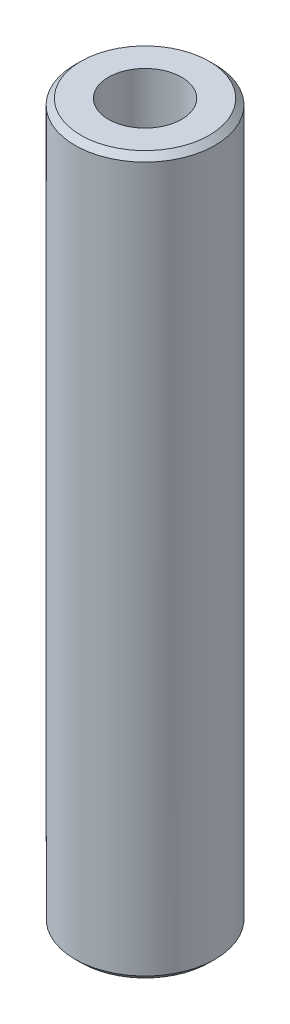
ISO-10303-21;
HEADER;
FILE_DESCRIPTION(('STEP AP214'),'2;1');
FILE_NAME('part.step','',(''),(''),'','','');
FILE_SCHEMA(('AUTOMOTIVE_DESIGN { 1 0 10303 214 1 1 1 1 }'));
ENDSEC;
DATA;
#1=APPLICATION_CONTEXT('core data for automotive mechanical design processes');
#2=APPLICATION_PROTOCOL_DEFINITION('international standard','automotive_design',2000,#1);
#3=PRODUCT_CONTEXT('',#1,'mechanical');
#4=PRODUCT('Part','Part','',(#3));
#5=PRODUCT_RELATED_PRODUCT_CATEGORY('part','',(#4));
#6=PRODUCT_DEFINITION_FORMATION('','',#4);
#7=PRODUCT_DEFINITION_CONTEXT('part definition',#1,'design');
#8=PRODUCT_DEFINITION('design','',#6,#7);
#9=PRODUCT_DEFINITION_SHAPE('','',#8);
#10=(LENGTH_UNIT() NAMED_UNIT(*) SI_UNIT(.MILLI.,.METRE.));
#11=(NAMED_UNIT(*) PLANE_ANGLE_UNIT() SI_UNIT($,.RADIAN.));
#12=(NAMED_UNIT(*) SI_UNIT($,.STERADIAN.) SOLID_ANGLE_UNIT());
#13=UNCERTAINTY_MEASURE_WITH_UNIT(LENGTH_MEASURE(1.E-05),#10,'distance_accuracy_value','');
#14=(GEOMETRIC_REPRESENTATION_CONTEXT(3) GLOBAL_UNCERTAINTY_ASSIGNED_CONTEXT((#13)) GLOBAL_UNIT_ASSIGNED_CONTEXT((#10,
#11,#12)) REPRESENTATION_CONTEXT('',''));
#15=CARTESIAN_POINT('',(0.,0.,0.));
#16=DIRECTION('',(0.,0.,1.));
#17=DIRECTION('',(1.,0.,0.));
#18=AXIS2_PLACEMENT_3D('',#15,#16,#17);
#19=CARTESIAN_POINT('',(0.,24.384,0.));
#20=DIRECTION('',(0.,-1.,0.));
#21=DIRECTION('',(0.,0.,-1.));
#22=AXIS2_PLACEMENT_3D('',#19,#20,#21);
#23=CYLINDRICAL_SURFACE('',#22,4.7625);
#24=CARTESIAN_POINT('',(0.,-23.987125,0.));
#25=DIRECTION('',(0.,1.,0.));
#26=DIRECTION('',(0.,0.,1.));
#27=AXIS2_PLACEMENT_3D('',#24,#25,#26);
#28=CIRCLE('',#27,4.7625);
#29=CARTESIAN_POINT('',(0.,-23.987125,-4.7625));
#30=VERTEX_POINT('',#29);
#31=EDGE_CURVE('E45',#30,#30,#28,.T.);
#32=CARTESIAN_POINT('',(0.,23.987125,0.));
#33=DIRECTION('',(0.,1.,0.));
#34=DIRECTION('',(0.,0.,1.));
#35=AXIS2_PLACEMENT_3D('',#32,#33,#34);
#36=CIRCLE('',#35,4.7625);
#37=CARTESIAN_POINT('',(0.,23.987125,-4.7625));
#38=VERTEX_POINT('',#37);
#39=EDGE_CURVE('E49',#38,#38,#36,.F.);
#40=CARTESIAN_POINT('',(0.,-23.987125,-4.7625));
#41=CARTESIAN_POINT('',(0.,-23.4873932291666,-4.7625));
#42=CARTESIAN_POINT('',(0.,-22.9876614583333,-4.7625));
#43=CARTESIAN_POINT('',(0.,-21.9881979166666,-4.7625));
#44=CARTESIAN_POINT('',(0.,-21.4884661458333,-4.7625));
#45=CARTESIAN_POINT('',(0.,-20.4890026041666,-4.7625));
#46=CARTESIAN_POINT('',(0.,-19.9892708333333,-4.7625));
#47=CARTESIAN_POINT('',(0.,-18.9898072916666,-4.7625));
#48=CARTESIAN_POINT('',(0.,-18.4900755208333,-4.7625));
#49=CARTESIAN_POINT('',(0.,-17.4906119791666,-4.7625));
#50=CARTESIAN_POINT('',(0.,-16.9908802083333,-4.7625));
#51=CARTESIAN_POINT('',(0.,-15.9914166666666,-4.7625));
#52=CARTESIAN_POINT('',(0.,-15.4916848958333,-4.7625));
#53=CARTESIAN_POINT('',(0.,-14.4922213541666,-4.7625));
#54=CARTESIAN_POINT('',(0.,-13.9924895833333,-4.7625));
#55=CARTESIAN_POINT('',(0.,-12.9930260416666,-4.7625));
#56=CARTESIAN_POINT('',(0.,-12.4932942708333,-4.7625));
#57=CARTESIAN_POINT('',(0.,-11.4938307291666,-4.7625));
#58=CARTESIAN_POINT('',(0.,-10.9940989583333,-4.7625));
#59=CARTESIAN_POINT('',(0.,-9.99463541666664,-4.7625));
#60=CARTESIAN_POINT('',(0.,-9.4949036458333,-4.7625));
#61=CARTESIAN_POINT('',(0.,-8.49544010416663,-4.7625));
#62=CARTESIAN_POINT('',(0.,-7.9957083333333,-4.7625));
#63=CARTESIAN_POINT('',(0.,-6.99624479166664,-4.7625));
#64=CARTESIAN_POINT('',(0.,-6.4965130208333,-4.7625));
#65=CARTESIAN_POINT('',(0.,-5.49704947916664,-4.7625));
#66=CARTESIAN_POINT('',(0.,-4.9973177083333,-4.7625));
#67=CARTESIAN_POINT('',(0.,-3.99785416666664,-4.7625));
#68=CARTESIAN_POINT('',(0.,-3.49812239583331,-4.7625));
#69=CARTESIAN_POINT('',(0.,-2.49865885416664,-4.7625));
#70=CARTESIAN_POINT('',(0.,-1.99892708333331,-4.7625));
#71=CARTESIAN_POINT('',(0.,-0.999463541666639,-4.7625));
#72=CARTESIAN_POINT('',(0.,-0.499731770833305,-4.7625));
#73=CARTESIAN_POINT('',(0.,0.499731770833361,-4.7625));
#74=CARTESIAN_POINT('',(0.,0.999463541666694,-4.7625));
#75=CARTESIAN_POINT('',(0.,1.99892708333336,-4.7625));
#76=CARTESIAN_POINT('',(0.,2.49865885416669,-4.7625));
#77=CARTESIAN_POINT('',(0.,3.49812239583336,-4.7625));
#78=CARTESIAN_POINT('',(0.,3.99785416666669,-4.7625));
#79=CARTESIAN_POINT('',(0.,4.99731770833336,-4.7625));
#80=CARTESIAN_POINT('',(0.,5.49704947916669,-4.7625));
#81=CARTESIAN_POINT('',(0.,6.49651302083336,-4.7625));
#82=CARTESIAN_POINT('',(0.,6.99624479166669,-4.7625));
#83=CARTESIAN_POINT('',(0.,7.99570833333336,-4.7625));
#84=CARTESIAN_POINT('',(0.,8.49544010416669,-4.7625));
#85=CARTESIAN_POINT('',(0.,9.49490364583336,-4.7625));
#86=CARTESIAN_POINT('',(0.,9.99463541666669,-4.7625));
#87=CARTESIAN_POINT('',(0.,10.9940989583334,-4.7625));
#88=CARTESIAN_POINT('',(0.,11.4938307291667,-4.7625));
#89=CARTESIAN_POINT('',(0.,12.4932942708334,-4.7625));
#90=CARTESIAN_POINT('',(0.,12.9930260416667,-4.7625));
#91=CARTESIAN_POINT('',(0.,13.9924895833334,-4.7625));
#92=CARTESIAN_POINT('',(0.,14.4922213541667,-4.7625));
#93=CARTESIAN_POINT('',(0.,15.4916848958334,-4.7625));
#94=CARTESIAN_POINT('',(0.,15.9914166666667,-4.7625));
#95=CARTESIAN_POINT('',(0.,16.9908802083334,-4.7625));
#96=CARTESIAN_POINT('',(0.,17.4906119791667,-4.7625));
#97=CARTESIAN_POINT('',(0.,18.4900755208334,-4.7625));
#98=CARTESIAN_POINT('',(0.,18.9898072916667,-4.7625));
#99=CARTESIAN_POINT('',(0.,19.9892708333334,-4.7625));
#100=CARTESIAN_POINT('',(0.,20.4890026041667,-4.7625));
#101=CARTESIAN_POINT('',(0.,21.4884661458334,-4.7625));
#102=CARTESIAN_POINT('',(0.,21.9881979166667,-4.7625));
#103=CARTESIAN_POINT('',(0.,22.9876614583334,-4.7625));
#104=CARTESIAN_POINT('',(0.,23.4873932291667,-4.7625));
#105=CARTESIAN_POINT('',(0.,23.987125,-4.7625));
#106=B_SPLINE_CURVE_WITH_KNOTS('',3,(#40,#41,#42,#43,#44,#45,#46,#47,#48,#49,#50,#51,#52,#53,
#54,#55,#56,#57,#58,#59,#60,#61,#62,#63,#64,#65,#66,#67,#68,#69,#70,#71,#72,#73,#74,#75,#76,#77,
#78,#79,#80,#81,#82,#83,#84,#85,#86,#87,#88,#89,#90,#91,#92,#93,#94,#95,#96,#97,#98,#99,#100,
#101,#102,#103,#104,#105),.UNSPECIFIED.,.F.,.F.,(4,2,2,2,2,2,2,2,2,2,2,2,2,2,2,2,2,2,2,2,2,2,2,
2,2,2,2,2,2,2,2,2,4),(0.,1.4991953125,2.998390625,4.4975859375,5.99678125,7.4959765625,
8.995171875,10.4943671875,11.9935625,13.4927578125,14.991953125,16.4911484375,17.99034375,
19.4895390625,20.988734375,22.4879296875,23.987125,25.4863203125,26.985515625,28.4847109375,
29.98390625,31.4831015625,32.982296875,34.4814921875,35.9806875,37.4798828125,38.979078125,
40.4782734375,41.97746875,43.4766640625,44.975859375,46.4750546875,47.97425),.UNSPECIFIED.);
#107=EDGE_CURVE('BSEAM33',#30,#38,#106,.T.);
#108=ORIENTED_EDGE('',*,*,#31,.T.);
#109=ORIENTED_EDGE('',*,*,#39,.T.);
#110=ORIENTED_EDGE('',*,*,#107,.T.);
#111=ORIENTED_EDGE('',*,*,#107,.F.);
#112=EDGE_LOOP('',(#108,#110,#109,#111));
#113=FACE_BOUND('',#112,.T.);
#114=ADVANCED_FACE('F33',(#113),#23,.T.);
#115=CARTESIAN_POINT('',(0.,24.384,0.));
#116=DIRECTION('',(0.,1.,0.));
#117=DIRECTION('',(0.,0.,1.));
#118=AXIS2_PLACEMENT_3D('',#115,#116,#117);
#119=PLANE('',#118);
#120=CARTESIAN_POINT('',(0.,24.384,0.));
#121=DIRECTION('',(0.,1.,0.));
#122=DIRECTION('',(0.,0.,1.));
#123=AXIS2_PLACEMENT_3D('',#120,#121,#122);
#124=CIRCLE('',#123,2.4892);
#125=CARTESIAN_POINT('',(0.,24.384,2.4892));
#126=VERTEX_POINT('',#125);
#127=EDGE_CURVE('E57',#126,#126,#124,.T.);
#128=ORIENTED_EDGE('',*,*,#127,.F.);
#129=EDGE_LOOP('',(#128));
#130=FACE_BOUND('',#129,.T.);
#131=CARTESIAN_POINT('',(0.,24.384,0.));
#132=DIRECTION('',(0.,1.,0.));
#133=DIRECTION('',(0.,0.,1.));
#134=AXIS2_PLACEMENT_3D('',#131,#132,#133);
#135=CIRCLE('',#134,4.36562500000003);
#136=CARTESIAN_POINT('',(0.,24.384,4.36562500000003));
#137=VERTEX_POINT('',#136);
#138=EDGE_CURVE('E10',#137,#137,#135,.T.);
#139=ORIENTED_EDGE('',*,*,#138,.T.);
#140=EDGE_LOOP('',(#139));
#141=FACE_BOUND('',#140,.T.);
#142=ADVANCED_FACE('F63',(#130,#141),#119,.T.);
#143=CARTESIAN_POINT('',(0.,-24.384,0.));
#144=DIRECTION('',(0.,1.,0.));
#145=DIRECTION('',(0.,0.,1.));
#146=AXIS2_PLACEMENT_3D('',#143,#144,#145);
#147=PLANE('',#146);
#148=CARTESIAN_POINT('',(0.,-24.384,0.));
#149=DIRECTION('',(0.,1.,0.));
#150=DIRECTION('',(0.,0.,1.));
#151=AXIS2_PLACEMENT_3D('',#148,#149,#150);
#152=CIRCLE('',#151,2.4892);
#153=CARTESIAN_POINT('',(0.,-24.384,2.4892));
#154=VERTEX_POINT('',#153);
#155=EDGE_CURVE('E54',#154,#154,#152,.T.);
#156=ORIENTED_EDGE('',*,*,#155,.T.);
#157=EDGE_LOOP('',(#156));
#158=FACE_BOUND('',#157,.T.);
#159=CARTESIAN_POINT('',(0.,-24.384,0.));
#160=DIRECTION('',(0.,1.,0.));
#161=DIRECTION('',(0.,0.,1.));
#162=AXIS2_PLACEMENT_3D('',#159,#160,#161);
#163=CIRCLE('',#162,4.36562499999996);
#164=CARTESIAN_POINT('',(0.,-24.384,4.36562499999996));
#165=VERTEX_POINT('',#164);
#166=EDGE_CURVE('E41',#165,#165,#163,.F.);
#167=ORIENTED_EDGE('',*,*,#166,.T.);
#168=EDGE_LOOP('',(#167));
#169=FACE_BOUND('',#168,.T.);
#170=ADVANCED_FACE('F65',(#158,#169),#147,.F.);
#171=CARTESIAN_POINT('',(0.,-23.987125,0.));
#172=DIRECTION('',(0.,1.,0.));
#173=DIRECTION('',(0.,0.,1.));
#174=AXIS2_PLACEMENT_3D('',#171,#172,#173);
#175=CONICAL_SURFACE('',#174,4.7625,0.785398163397446);
#176=ORIENTED_EDGE('',*,*,#166,.F.);
#177=EDGE_LOOP('',(#176));
#178=FACE_BOUND('',#177,.T.);
#179=ORIENTED_EDGE('',*,*,#31,.F.);
#180=EDGE_LOOP('',(#179));
#181=FACE_BOUND('',#180,.T.);
#182=ADVANCED_FACE('F71',(#178,#181),#175,.T.);
#183=CARTESIAN_POINT('',(0.,24.384,0.));
#184=DIRECTION('',(0.,-1.,0.));
#185=DIRECTION('',(0.,0.,-1.));
#186=AXIS2_PLACEMENT_3D('',#183,#184,#185);
#187=CONICAL_SURFACE('',#186,4.36562500000003,0.785398163397442);
#188=ORIENTED_EDGE('',*,*,#39,.F.);
#189=EDGE_LOOP('',(#188));
#190=FACE_BOUND('',#189,.T.);
#191=ORIENTED_EDGE('',*,*,#138,.F.);
#192=EDGE_LOOP('',(#191));
#193=FACE_BOUND('',#192,.T.);
#194=ADVANCED_FACE('F36',(#190,#193),#187,.T.);
#195=CARTESIAN_POINT('',(0.,-24.384,0.));
#196=DIRECTION('',(0.,1.,0.));
#197=DIRECTION('',(0.,0.,1.));
#198=AXIS2_PLACEMENT_3D('',#195,#196,#197);
#199=CYLINDRICAL_SURFACE('',#198,2.4892);
#200=CARTESIAN_POINT('',(0.,-24.384,2.4892));
#201=CARTESIAN_POINT('',(0.,-23.876,2.4892));
#202=CARTESIAN_POINT('',(0.,-23.368,2.4892));
#203=CARTESIAN_POINT('',(0.,-22.352,2.4892));
#204=CARTESIAN_POINT('',(0.,-21.844,2.4892));
#205=CARTESIAN_POINT('',(0.,-20.828,2.4892));
#206=CARTESIAN_POINT('',(0.,-20.32,2.4892));
#207=CARTESIAN_POINT('',(0.,-19.304,2.4892));
#208=CARTESIAN_POINT('',(0.,-18.796,2.4892));
#209=CARTESIAN_POINT('',(0.,-17.78,2.4892));
#210=CARTESIAN_POINT('',(0.,-17.272,2.4892));
#211=CARTESIAN_POINT('',(0.,-16.256,2.4892));
#212=CARTESIAN_POINT('',(0.,-15.748,2.4892));
#213=CARTESIAN_POINT('',(0.,-14.732,2.4892));
#214=CARTESIAN_POINT('',(0.,-14.224,2.4892));
#215=CARTESIAN_POINT('',(0.,-13.208,2.4892));
#216=CARTESIAN_POINT('',(0.,-12.7,2.4892));
#217=CARTESIAN_POINT('',(0.,-11.684,2.4892));
#218=CARTESIAN_POINT('',(0.,-11.176,2.4892));
#219=CARTESIAN_POINT('',(0.,-10.16,2.4892));
#220=CARTESIAN_POINT('',(0.,-9.652,2.4892));
#221=CARTESIAN_POINT('',(0.,-8.636,2.4892));
#222=CARTESIAN_POINT('',(0.,-8.128,2.4892));
#223=CARTESIAN_POINT('',(0.,-7.112,2.4892));
#224=CARTESIAN_POINT('',(0.,-6.604,2.4892));
#225=CARTESIAN_POINT('',(0.,-5.588,2.4892));
#226=CARTESIAN_POINT('',(0.,-5.08,2.4892));
#227=CARTESIAN_POINT('',(0.,-4.064,2.4892));
#228=CARTESIAN_POINT('',(0.,-3.556,2.4892));
#229=CARTESIAN_POINT('',(0.,-2.54000000000001,2.4892));
#230=CARTESIAN_POINT('',(0.,-2.032,2.4892));
#231=CARTESIAN_POINT('',(0.,-1.016,2.4892));
#232=CARTESIAN_POINT('',(0.,-0.508000000000004,2.4892));
#233=CARTESIAN_POINT('',(0.,0.507999999999997,2.4892));
#234=CARTESIAN_POINT('',(0.,1.016,2.4892));
#235=CARTESIAN_POINT('',(0.,2.032,2.4892));
#236=CARTESIAN_POINT('',(0.,2.54,2.4892));
#237=CARTESIAN_POINT('',(0.,3.556,2.4892));
#238=CARTESIAN_POINT('',(0.,4.064,2.4892));
#239=CARTESIAN_POINT('',(0.,5.08,2.4892));
#240=CARTESIAN_POINT('',(0.,5.588,2.4892));
#241=CARTESIAN_POINT('',(0.,6.604,2.4892));
#242=CARTESIAN_POINT('',(0.,7.112,2.4892));
#243=CARTESIAN_POINT('',(0.,8.128,2.4892));
#244=CARTESIAN_POINT('',(0.,8.636,2.4892));
#245=CARTESIAN_POINT('',(0.,9.652,2.4892));
#246=CARTESIAN_POINT('',(0.,10.16,2.4892));
#247=CARTESIAN_POINT('',(0.,11.176,2.4892));
#248=CARTESIAN_POINT('',(0.,11.684,2.4892));
#249=CARTESIAN_POINT('',(0.,12.7,2.4892));
#250=CARTESIAN_POINT('',(0.,13.208,2.4892));
#251=CARTESIAN_POINT('',(0.,14.224,2.4892));
#252=CARTESIAN_POINT('',(0.,14.732,2.4892));
#253=CARTESIAN_POINT('',(0.,15.748,2.4892));
#254=CARTESIAN_POINT('',(0.,16.256,2.4892));
#255=CARTESIAN_POINT('',(0.,17.272,2.4892));
#256=CARTESIAN_POINT('',(0.,17.78,2.4892));
#257=CARTESIAN_POINT('',(0.,18.796,2.4892));
#258=CARTESIAN_POINT('',(0.,19.304,2.4892));
#259=CARTESIAN_POINT('',(0.,20.32,2.4892));
#260=CARTESIAN_POINT('',(0.,20.828,2.4892));
#261=CARTESIAN_POINT('',(0.,21.844,2.4892));
#262=CARTESIAN_POINT('',(0.,22.352,2.4892));
#263=CARTESIAN_POINT('',(0.,23.368,2.4892));
#264=CARTESIAN_POINT('',(0.,23.876,2.4892));
#265=CARTESIAN_POINT('',(0.,24.384,2.4892));
#266=B_SPLINE_CURVE_WITH_KNOTS('',3,(#200,#201,#202,#203,#204,#205,#206,#207,#208,#209,#210,
#211,#212,#213,#214,#215,#216,#217,#218,#219,#220,#221,#222,#223,#224,#225,#226,#227,#228,#229,
#230,#231,#232,#233,#234,#235,#236,#237,#238,#239,#240,#241,#242,#243,#244,#245,#246,#247,#248,
#249,#250,#251,#252,#253,#254,#255,#256,#257,#258,#259,#260,#261,#262,#263,#264,#265),
.UNSPECIFIED.,.F.,.F.,(4,2,2,2,2,2,2,2,2,2,2,2,2,2,2,2,2,2,2,2,2,2,2,2,2,2,2,2,2,2,2,2,4),(0.,
1.524,3.048,4.572,6.096,7.62,9.144,10.668,12.192,13.716,15.24,16.764,18.288,19.812,21.336,22.86,
24.384,25.908,27.432,28.956,30.48,32.004,33.528,35.052,36.576,38.1,39.624,41.148,42.672,44.196,
45.72,47.244,48.768),.UNSPECIFIED.);
#267=EDGE_CURVE('BSEAM61',#154,#126,#266,.T.);
#268=ORIENTED_EDGE('',*,*,#155,.F.);
#269=ORIENTED_EDGE('',*,*,#127,.T.);
#270=ORIENTED_EDGE('',*,*,#267,.T.);
#271=ORIENTED_EDGE('',*,*,#267,.F.);
#272=EDGE_LOOP('',(#268,#270,#269,#271));
#273=FACE_BOUND('',#272,.T.);
#274=ADVANCED_FACE('F61',(#273),#199,.F.);
#275=CLOSED_SHELL('',(#114,#142,#170,#182,#194,#274));
#276=MANIFOLD_SOLID_BREP('B2',#275);
#277=ADVANCED_BREP_SHAPE_REPRESENTATION('',(#18,#276),#14);
#278=SHAPE_DEFINITION_REPRESENTATION(#9,#277);
ENDSEC;
END-ISO-10303-21;
